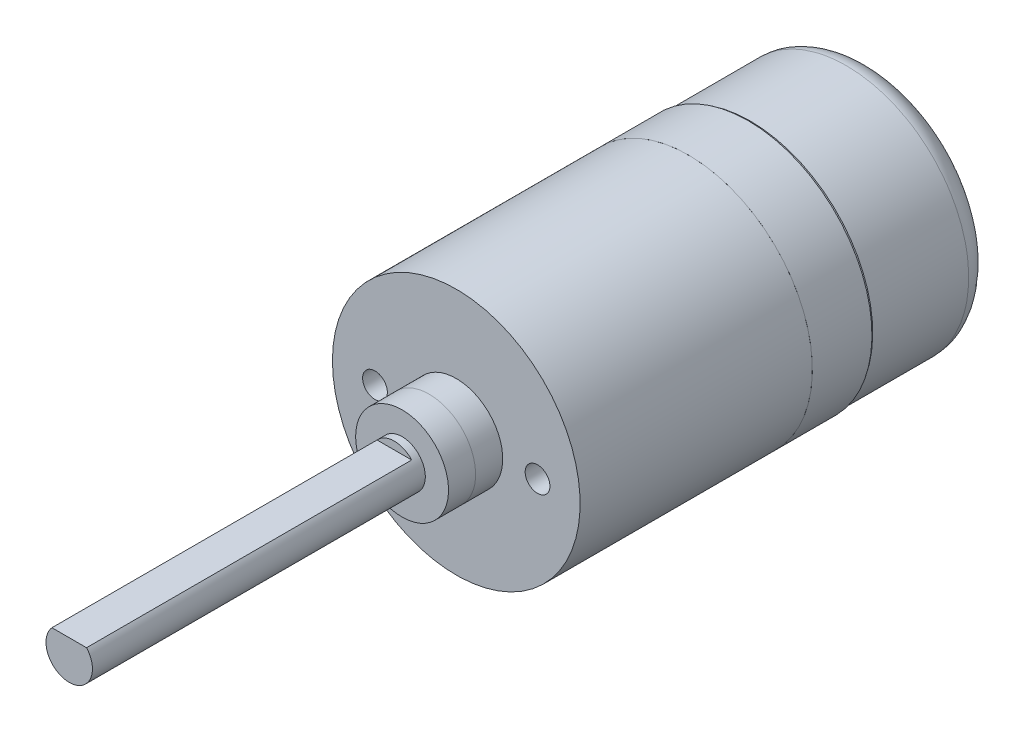
ISO-10303-21;
HEADER;
FILE_DESCRIPTION(('STEP AP214'),'2;1');
FILE_NAME('part.step','',(''),(''),'','','');
FILE_SCHEMA(('AUTOMOTIVE_DESIGN { 1 0 10303 214 1 1 1 1 }'));
ENDSEC;
DATA;
#1=APPLICATION_CONTEXT('core data for automotive mechanical design processes');
#2=APPLICATION_PROTOCOL_DEFINITION('international standard','automotive_design',2000,#1);
#3=PRODUCT_CONTEXT('',#1,'mechanical');
#4=PRODUCT('Part','Part','',(#3));
#5=PRODUCT_RELATED_PRODUCT_CATEGORY('part','',(#4));
#6=PRODUCT_DEFINITION_FORMATION('','',#4);
#7=PRODUCT_DEFINITION_CONTEXT('part definition',#1,'design');
#8=PRODUCT_DEFINITION('design','',#6,#7);
#9=PRODUCT_DEFINITION_SHAPE('','',#8);
#10=(LENGTH_UNIT() NAMED_UNIT(*) SI_UNIT(.MILLI.,.METRE.));
#11=(NAMED_UNIT(*) PLANE_ANGLE_UNIT() SI_UNIT($,.RADIAN.));
#12=(NAMED_UNIT(*) SI_UNIT($,.STERADIAN.) SOLID_ANGLE_UNIT());
#13=UNCERTAINTY_MEASURE_WITH_UNIT(LENGTH_MEASURE(1.E-05),#10,'distance_accuracy_value','');
#14=(GEOMETRIC_REPRESENTATION_CONTEXT(3) GLOBAL_UNCERTAINTY_ASSIGNED_CONTEXT((#13)) GLOBAL_UNIT_ASSIGNED_CONTEXT((#10,
#11,#12)) REPRESENTATION_CONTEXT('',''));
#15=CARTESIAN_POINT('',(0.,0.,0.));
#16=DIRECTION('',(0.,0.,1.));
#17=DIRECTION('',(1.,0.,0.));
#18=AXIS2_PLACEMENT_3D('',#15,#16,#17);
#19=CARTESIAN_POINT('',(-5.25,0.,15.));
#20=DIRECTION('',(0.,0.,1.));
#21=DIRECTION('',(1.,0.,0.));
#22=AXIS2_PLACEMENT_3D('',#19,#20,#21);
#23=CYLINDRICAL_SURFACE('',#22,0.8);
#24=CARTESIAN_POINT('',(-5.25,0.,12.5));
#25=DIRECTION('',(0.,0.,1.));
#26=DIRECTION('',(1.,0.,0.));
#27=AXIS2_PLACEMENT_3D('',#24,#25,#26);
#28=CIRCLE('',#27,0.8);
#29=CARTESIAN_POINT('',(-4.45,0.,12.5));
#30=VERTEX_POINT('',#29);
#31=EDGE_CURVE('P0_E11',#30,#30,#28,.T.);
#32=ORIENTED_EDGE('',*,*,#31,.F.);
#33=EDGE_LOOP('',(#32));
#34=FACE_BOUND('',#33,.T.);
#35=CARTESIAN_POINT('',(-5.25,0.,15.));
#36=DIRECTION('',(0.,0.,1.));
#37=DIRECTION('',(1.,0.,0.));
#38=AXIS2_PLACEMENT_3D('',#35,#36,#37);
#39=CIRCLE('',#38,0.8);
#40=CARTESIAN_POINT('',(-4.45,0.,15.));
#41=VERTEX_POINT('',#40);
#42=EDGE_CURVE('P0_E91',#41,#41,#39,.T.);
#43=ORIENTED_EDGE('',*,*,#42,.T.);
#44=EDGE_LOOP('',(#43));
#45=FACE_BOUND('',#44,.T.);
#46=ADVANCED_FACE('P0_F16',(#34,#45),#23,.F.);
#47=CARTESIAN_POINT('',(-5.25,0.,12.5));
#48=DIRECTION('',(0.,0.,1.));
#49=DIRECTION('',(1.,0.,0.));
#50=AXIS2_PLACEMENT_3D('',#47,#48,#49);
#51=CONICAL_SURFACE('',#50,0.8,1.02974425867665);
#52=CARTESIAN_POINT('',(-5.25,0.,12.0193115047779));
#53=VERTEX_POINT('',#52);
#54=VERTEX_LOOP('',#53);
#55=FACE_BOUND('',#54,.T.);
#56=ORIENTED_EDGE('',*,*,#31,.T.);
#57=EDGE_LOOP('',(#56));
#58=FACE_BOUND('',#57,.T.);
#59=ADVANCED_FACE('P0_F179',(#55,#58),#51,.F.);
#60=CARTESIAN_POINT('',(5.25,0.,15.));
#61=DIRECTION('',(0.,0.,1.));
#62=DIRECTION('',(1.,0.,0.));
#63=AXIS2_PLACEMENT_3D('',#60,#61,#62);
#64=CYLINDRICAL_SURFACE('',#63,0.8);
#65=CARTESIAN_POINT('',(5.25,0.,12.5));
#66=DIRECTION('',(0.,0.,1.));
#67=DIRECTION('',(1.,0.,0.));
#68=AXIS2_PLACEMENT_3D('',#65,#66,#67);
#69=CIRCLE('',#68,0.8);
#70=CARTESIAN_POINT('',(6.05,0.,12.5));
#71=VERTEX_POINT('',#70);
#72=EDGE_CURVE('P0_E25',#71,#71,#69,.T.);
#73=ORIENTED_EDGE('',*,*,#72,.F.);
#74=EDGE_LOOP('',(#73));
#75=FACE_BOUND('',#74,.T.);
#76=CARTESIAN_POINT('',(5.25,0.,15.));
#77=DIRECTION('',(0.,0.,1.));
#78=DIRECTION('',(1.,0.,0.));
#79=AXIS2_PLACEMENT_3D('',#76,#77,#78);
#80=CIRCLE('',#79,0.8);
#81=CARTESIAN_POINT('',(6.05,0.,15.));
#82=VERTEX_POINT('',#81);
#83=EDGE_CURVE('P0_E96',#82,#82,#80,.T.);
#84=ORIENTED_EDGE('',*,*,#83,.T.);
#85=EDGE_LOOP('',(#84));
#86=FACE_BOUND('',#85,.T.);
#87=ADVANCED_FACE('P0_F183',(#75,#86),#64,.F.);
#88=CARTESIAN_POINT('',(5.25,0.,12.5));
#89=DIRECTION('',(0.,0.,1.));
#90=DIRECTION('',(1.,0.,0.));
#91=AXIS2_PLACEMENT_3D('',#88,#89,#90);
#92=CONICAL_SURFACE('',#91,0.8,1.02974425867665);
#93=CARTESIAN_POINT('',(5.25,0.,12.0193115047779));
#94=VERTEX_POINT('',#93);
#95=VERTEX_LOOP('',#94);
#96=FACE_BOUND('',#95,.T.);
#97=ORIENTED_EDGE('',*,*,#72,.T.);
#98=EDGE_LOOP('',(#97));
#99=FACE_BOUND('',#98,.T.);
#100=ADVANCED_FACE('P0_F189',(#96,#99),#92,.F.);
#101=CARTESIAN_POINT('',(0.,0.,19.));
#102=DIRECTION('',(0.,0.,1.));
#103=DIRECTION('',(1.,0.,0.));
#104=AXIS2_PLACEMENT_3D('',#101,#102,#103);
#105=PLANE('',#104);
#106=CARTESIAN_POINT('',(0.,0.,19.));
#107=DIRECTION('',(0.,0.,1.));
#108=DIRECTION('',(1.,0.,0.));
#109=AXIS2_PLACEMENT_3D('',#106,#107,#108);
#110=CIRCLE('',#109,1.5);
#111=CARTESIAN_POINT('',(1.11803398874988,1.,19.));
#112=VERTEX_POINT('',#111);
#113=CARTESIAN_POINT('',(-1.11803398874988,1.,19.));
#114=VERTEX_POINT('',#113);
#115=EDGE_CURVE('P0_E115',#112,#114,#110,.T.);
#116=ORIENTED_EDGE('',*,*,#115,.T.);
#117=DIRECTION('',(1.,0.,0.));
#118=VECTOR('',#117,1.);
#119=CARTESIAN_POINT('',(-1.11803398874988,1.,19.));
#120=LINE('',#119,#118);
#121=EDGE_CURVE('P0_E19',#114,#112,#120,.T.);
#122=ORIENTED_EDGE('',*,*,#121,.T.);
#123=EDGE_LOOP('',(#116,#122));
#124=FACE_BOUND('',#123,.T.);
#125=ADVANCED_FACE('P0_F174',(#124),#105,.T.);
#126=CARTESIAN_POINT('',(-1.11803398874988,1.,19.));
#127=DIRECTION('',(0.,-1.,0.));
#128=DIRECTION('',(0.,0.,-1.));
#129=AXIS2_PLACEMENT_3D('',#126,#127,#128);
#130=PLANE('',#129);
#131=DIRECTION('',(1.,0.,0.));
#132=VECTOR('',#131,1.);
#133=CARTESIAN_POINT('',(-1.11803398874988,1.,40.));
#134=LINE('',#133,#132);
#135=CARTESIAN_POINT('',(-1.11803398874988,1.,40.));
#136=VERTEX_POINT('',#135);
#137=CARTESIAN_POINT('',(1.11803398874988,1.,40.));
#138=VERTEX_POINT('',#137);
#139=EDGE_CURVE('P0_E127',#136,#138,#134,.T.);
#140=ORIENTED_EDGE('',*,*,#139,.T.);
#141=DIRECTION('',(0.,0.,1.));
#142=VECTOR('',#141,1.);
#143=CARTESIAN_POINT('',(1.11803398874988,1.,19.));
#144=LINE('',#143,#142);
#145=EDGE_CURVE('P0_E108',#112,#138,#144,.T.);
#146=ORIENTED_EDGE('',*,*,#145,.F.);
#147=ORIENTED_EDGE('',*,*,#121,.F.);
#148=DIRECTION('',(0.,0.,1.));
#149=VECTOR('',#148,1.);
#150=CARTESIAN_POINT('',(-1.11803398874988,1.,19.));
#151=LINE('',#150,#149);
#152=EDGE_CURVE('P0_E113',#114,#136,#151,.T.);
#153=ORIENTED_EDGE('',*,*,#152,.T.);
#154=EDGE_LOOP('',(#140,#146,#147,#153));
#155=FACE_BOUND('',#154,.T.);
#156=ADVANCED_FACE('P0_F170',(#155),#130,.F.);
#157=CARTESIAN_POINT('',(0.,8.,0.));
#158=DIRECTION('',(0.,0.,-1.));
#159=DIRECTION('',(0.,-1.,0.));
#160=AXIS2_PLACEMENT_3D('',#157,#158,#159);
#161=PLANE('',#160);
#162=CARTESIAN_POINT('',(0.,0.,0.));
#163=DIRECTION('',(0.,0.,-1.));
#164=DIRECTION('',(-1.,0.,0.));
#165=AXIS2_PLACEMENT_3D('',#162,#163,#164);
#166=CIRCLE('',#165,8.);
#167=CARTESIAN_POINT('',(-8.,0.,0.));
#168=VERTEX_POINT('',#167);
#169=EDGE_CURVE('P0_E105',#168,#168,#166,.T.);
#170=ORIENTED_EDGE('',*,*,#169,.T.);
#171=EDGE_LOOP('',(#170));
#172=FACE_BOUND('',#171,.T.);
#173=ADVANCED_FACE('P0_F165',(#172),#161,.T.);
#174=CARTESIAN_POINT('',(0.,0.,0.));
#175=DIRECTION('',(0.,0.,-1.));
#176=DIRECTION('',(-1.,0.,0.));
#177=AXIS2_PLACEMENT_3D('',#174,#175,#176);
#178=CYLINDRICAL_SURFACE('',#177,8.);
#179=CARTESIAN_POINT('',(0.,0.,15.));
#180=DIRECTION('',(0.,0.,-1.));
#181=DIRECTION('',(-1.,0.,0.));
#182=AXIS2_PLACEMENT_3D('',#179,#180,#181);
#183=CIRCLE('',#182,8.);
#184=CARTESIAN_POINT('',(-8.,0.,15.));
#185=VERTEX_POINT('',#184);
#186=EDGE_CURVE('P0_E100',#185,#185,#183,.T.);
#187=ORIENTED_EDGE('',*,*,#186,.T.);
#188=EDGE_LOOP('',(#187));
#189=FACE_BOUND('',#188,.T.);
#190=ORIENTED_EDGE('',*,*,#169,.F.);
#191=EDGE_LOOP('',(#190));
#192=FACE_BOUND('',#191,.T.);
#193=ADVANCED_FACE('P0_F152',(#189,#192),#178,.T.);
#194=CARTESIAN_POINT('',(0.,3.,15.));
#195=DIRECTION('',(0.,0.,1.));
#196=DIRECTION('',(1.,0.,0.));
#197=AXIS2_PLACEMENT_3D('',#194,#195,#196);
#198=PLANE('',#197);
#199=CARTESIAN_POINT('',(0.,0.,15.));
#200=DIRECTION('',(0.,0.,-1.));
#201=DIRECTION('',(-1.,0.,0.));
#202=AXIS2_PLACEMENT_3D('',#199,#200,#201);
#203=CIRCLE('',#202,3.);
#204=CARTESIAN_POINT('',(-3.,0.,15.));
#205=VERTEX_POINT('',#204);
#206=EDGE_CURVE('P0_E102',#205,#205,#203,.T.);
#207=ORIENTED_EDGE('',*,*,#206,.T.);
#208=EDGE_LOOP('',(#207));
#209=FACE_BOUND('',#208,.T.);
#210=ORIENTED_EDGE('',*,*,#83,.F.);
#211=EDGE_LOOP('',(#210));
#212=FACE_BOUND('',#211,.T.);
#213=ORIENTED_EDGE('',*,*,#42,.F.);
#214=EDGE_LOOP('',(#213));
#215=FACE_BOUND('',#214,.T.);
#216=ORIENTED_EDGE('',*,*,#186,.F.);
#217=EDGE_LOOP('',(#216));
#218=FACE_BOUND('',#217,.T.);
#219=ADVANCED_FACE('P0_F146',(#209,#212,#215,#218),#198,.T.);
#220=CARTESIAN_POINT('',(0.,0.,0.));
#221=DIRECTION('',(0.,0.,-1.));
#222=DIRECTION('',(-1.,0.,0.));
#223=AXIS2_PLACEMENT_3D('',#220,#221,#222);
#224=CYLINDRICAL_SURFACE('',#223,3.);
#225=CARTESIAN_POINT('',(0.,0.,16.75));
#226=DIRECTION('',(0.,0.,1.));
#227=DIRECTION('',(-1.,0.,0.));
#228=AXIS2_PLACEMENT_3D('',#225,#226,#227);
#229=CIRCLE('',#228,3.);
#230=CARTESIAN_POINT('',(-3.,0.,16.75));
#231=VERTEX_POINT('',#230);
#232=EDGE_CURVE('P0_E140',#231,#231,#229,.T.);
#233=ORIENTED_EDGE('',*,*,#232,.F.);
#234=EDGE_LOOP('',(#233));
#235=FACE_BOUND('',#234,.T.);
#236=ORIENTED_EDGE('',*,*,#206,.F.);
#237=EDGE_LOOP('',(#236));
#238=FACE_BOUND('',#237,.T.);
#239=ADVANCED_FACE('P0_F145',(#235,#238),#224,.T.);
#240=CARTESIAN_POINT('',(0.,1.5,18.5));
#241=DIRECTION('',(0.,0.,1.));
#242=DIRECTION('',(1.,0.,0.));
#243=AXIS2_PLACEMENT_3D('',#240,#241,#242);
#244=PLANE('',#243);
#245=CARTESIAN_POINT('',(0.,0.,18.5));
#246=DIRECTION('',(0.,0.,-1.));
#247=DIRECTION('',(-1.,0.,0.));
#248=AXIS2_PLACEMENT_3D('',#245,#246,#247);
#249=CIRCLE('',#248,1.5);
#250=CARTESIAN_POINT('',(-1.5,0.,18.5));
#251=VERTEX_POINT('',#250);
#252=EDGE_CURVE('P0_E118',#251,#251,#249,.T.);
#253=ORIENTED_EDGE('',*,*,#252,.T.);
#254=EDGE_LOOP('',(#253));
#255=FACE_BOUND('',#254,.T.);
#256=CARTESIAN_POINT('',(0.,0.,18.5));
#257=DIRECTION('',(0.,0.,-1.));
#258=DIRECTION('',(-1.,0.,0.));
#259=AXIS2_PLACEMENT_3D('',#256,#257,#258);
#260=CIRCLE('',#259,3.);
#261=CARTESIAN_POINT('',(-3.,0.,18.5));
#262=VERTEX_POINT('',#261);
#263=EDGE_CURVE('P0_E133',#262,#262,#260,.T.);
#264=ORIENTED_EDGE('',*,*,#263,.F.);
#265=EDGE_LOOP('',(#264));
#266=FACE_BOUND('',#265,.T.);
#267=ADVANCED_FACE('P0_F150',(#255,#266),#244,.T.);
#268=CARTESIAN_POINT('',(0.,0.,0.));
#269=DIRECTION('',(0.,0.,-1.));
#270=DIRECTION('',(-1.,0.,0.));
#271=AXIS2_PLACEMENT_3D('',#268,#269,#270);
#272=CYLINDRICAL_SURFACE('',#271,1.5);
#273=ORIENTED_EDGE('',*,*,#152,.F.);
#274=ORIENTED_EDGE('',*,*,#115,.F.);
#275=ORIENTED_EDGE('',*,*,#145,.T.);
#276=CARTESIAN_POINT('',(0.,0.,40.));
#277=DIRECTION('',(0.,0.,-1.));
#278=DIRECTION('',(-1.,0.,0.));
#279=AXIS2_PLACEMENT_3D('',#276,#277,#278);
#280=CIRCLE('',#279,1.5);
#281=EDGE_CURVE('P0_E124',#138,#136,#280,.T.);
#282=ORIENTED_EDGE('',*,*,#281,.T.);
#283=EDGE_LOOP('',(#273,#274,#275,#282));
#284=FACE_BOUND('',#283,.T.);
#285=ORIENTED_EDGE('',*,*,#252,.F.);
#286=EDGE_LOOP('',(#285));
#287=FACE_BOUND('',#286,.T.);
#288=ADVANCED_FACE('P0_F192',(#284,#287),#272,.T.);
#289=CARTESIAN_POINT('',(0.,0.,40.));
#290=DIRECTION('',(0.,0.,1.));
#291=DIRECTION('',(1.,0.,0.));
#292=AXIS2_PLACEMENT_3D('',#289,#290,#291);
#293=PLANE('',#292);
#294=ORIENTED_EDGE('',*,*,#139,.F.);
#295=ORIENTED_EDGE('',*,*,#281,.F.);
#296=EDGE_LOOP('',(#294,#295));
#297=FACE_BOUND('',#296,.T.);
#298=ADVANCED_FACE('P0_F203',(#297),#293,.T.);
#299=CARTESIAN_POINT('',(0.,0.,0.));
#300=DIRECTION('',(0.,0.,-1.));
#301=DIRECTION('',(-1.,0.,0.));
#302=AXIS2_PLACEMENT_3D('',#299,#300,#301);
#303=CYLINDRICAL_SURFACE('',#302,3.);
#304=ORIENTED_EDGE('',*,*,#263,.T.);
#305=EDGE_LOOP('',(#304));
#306=FACE_BOUND('',#305,.T.);
#307=ORIENTED_EDGE('',*,*,#232,.T.);
#308=EDGE_LOOP('',(#307));
#309=FACE_BOUND('',#308,.T.);
#310=ADVANCED_FACE('P0_F142',(#306,#309),#303,.T.);
#311=CLOSED_SHELL('',(#46,#59,#87,#100,#125,#156,#173,#193,#219,#239,#267,#288,#298,#310));
#312=MANIFOLD_SOLID_BREP('P0_B1',#311);
#313=CARTESIAN_POINT('',(0.,0.,0.));
#314=DIRECTION('',(0.,0.,-1.));
#315=DIRECTION('',(0.,1.,0.));
#316=AXIS2_PLACEMENT_3D('',#313,#314,#315);
#317=CYLINDRICAL_SURFACE('',#316,6.);
#318=CARTESIAN_POINT('',(0.,0.,-3.85));
#319=DIRECTION('',(0.,0.,-1.));
#320=DIRECTION('',(0.,1.,0.));
#321=AXIS2_PLACEMENT_3D('',#318,#319,#320);
#322=CIRCLE('',#321,6.);
#323=CARTESIAN_POINT('',(0.,6.,-3.85));
#324=VERTEX_POINT('',#323);
#325=EDGE_CURVE('P1_E11',#324,#324,#322,.T.);
#326=ORIENTED_EDGE('',*,*,#325,.T.);
#327=EDGE_LOOP('',(#326));
#328=FACE_BOUND('',#327,.T.);
#329=CARTESIAN_POINT('',(0.,0.,-9.85));
#330=DIRECTION('',(0.,0.,-1.));
#331=DIRECTION('',(0.,1.,0.));
#332=AXIS2_PLACEMENT_3D('',#329,#330,#331);
#333=CIRCLE('',#332,6.);
#334=CARTESIAN_POINT('',(0.,6.,-9.85));
#335=VERTEX_POINT('',#334);
#336=EDGE_CURVE('P1_E55',#335,#335,#333,.T.);
#337=ORIENTED_EDGE('',*,*,#336,.F.);
#338=EDGE_LOOP('',(#337));
#339=FACE_BOUND('',#338,.T.);
#340=ADVANCED_FACE('P1_F16',(#328,#339),#317,.T.);
#341=CARTESIAN_POINT('',(0.,8.,-3.85));
#342=DIRECTION('',(0.,0.,-1.));
#343=DIRECTION('',(-1.,0.,0.));
#344=AXIS2_PLACEMENT_3D('',#341,#342,#343);
#345=PLANE('',#344);
#346=ORIENTED_EDGE('',*,*,#325,.F.);
#347=EDGE_LOOP('',(#346));
#348=FACE_BOUND('',#347,.T.);
#349=CARTESIAN_POINT('',(0.,0.,-3.85));
#350=DIRECTION('',(0.,0.,-1.));
#351=DIRECTION('',(0.,1.,0.));
#352=AXIS2_PLACEMENT_3D('',#349,#350,#351);
#353=CIRCLE('',#352,8.);
#354=CARTESIAN_POINT('',(0.,8.,-3.85));
#355=VERTEX_POINT('',#354);
#356=EDGE_CURVE('P1_E24',#355,#355,#353,.T.);
#357=ORIENTED_EDGE('',*,*,#356,.T.);
#358=EDGE_LOOP('',(#357));
#359=FACE_BOUND('',#358,.T.);
#360=ADVANCED_FACE('P1_F105',(#348,#359),#345,.T.);
#361=CARTESIAN_POINT('',(0.,0.,0.));
#362=DIRECTION('',(0.,0.,-1.));
#363=DIRECTION('',(0.,1.,0.));
#364=AXIS2_PLACEMENT_3D('',#361,#362,#363);
#365=CYLINDRICAL_SURFACE('',#364,8.);
#366=CARTESIAN_POINT('',(0.,0.,0.));
#367=DIRECTION('',(0.,0.,-1.));
#368=DIRECTION('',(0.,1.,0.));
#369=AXIS2_PLACEMENT_3D('',#366,#367,#368);
#370=CIRCLE('',#369,8.);
#371=CARTESIAN_POINT('',(0.,8.,0.));
#372=VERTEX_POINT('',#371);
#373=EDGE_CURVE('P1_E57',#372,#372,#370,.T.);
#374=ORIENTED_EDGE('',*,*,#373,.T.);
#375=EDGE_LOOP('',(#374));
#376=FACE_BOUND('',#375,.T.);
#377=ORIENTED_EDGE('',*,*,#356,.F.);
#378=EDGE_LOOP('',(#377));
#379=FACE_BOUND('',#378,.T.);
#380=ADVANCED_FACE('P1_F93',(#376,#379),#365,.T.);
#381=CARTESIAN_POINT('',(0.,0.,0.));
#382=DIRECTION('',(0.,0.,1.));
#383=DIRECTION('',(0.,-1.,0.));
#384=AXIS2_PLACEMENT_3D('',#381,#382,#383);
#385=PLANE('',#384);
#386=ORIENTED_EDGE('',*,*,#373,.F.);
#387=EDGE_LOOP('',(#386));
#388=FACE_BOUND('',#387,.T.);
#389=ADVANCED_FACE('P1_F79',(#388),#385,.T.);
#390=CARTESIAN_POINT('',(0.,6.,-9.85));
#391=DIRECTION('',(0.,0.,-1.));
#392=DIRECTION('',(-1.,0.,0.));
#393=AXIS2_PLACEMENT_3D('',#390,#391,#392);
#394=PLANE('',#393);
#395=ORIENTED_EDGE('',*,*,#336,.T.);
#396=EDGE_LOOP('',(#395));
#397=FACE_BOUND('',#396,.T.);
#398=ADVANCED_FACE('P1_F52',(#397),#394,.T.);
#399=CLOSED_SHELL('',(#340,#360,#380,#389,#398));
#400=MANIFOLD_SOLID_BREP('P1_B1',#399);
#401=CARTESIAN_POINT('',(0.,4.9,-12.2));
#402=CARTESIAN_POINT('',(0.641408495655411,4.9,-12.2));
#403=CARTESIAN_POINT('',(1.28256463747401,4.77246611397071,-12.2));
#404=CARTESIAN_POINT('',(2.46773299970387,4.2815533046399,-12.2));
#405=CARTESIAN_POINT('',(3.01127893102555,3.9183675246029,-12.2));
#406=CARTESIAN_POINT('',(3.91836752460263,3.01127893102527,-12.2));
#407=CARTESIAN_POINT('',(4.28155330463977,2.46773299970391,-12.2));
#408=CARTESIAN_POINT('',(4.77246611397085,1.28256463747397,-12.2));
#409=CARTESIAN_POINT('',(4.9,0.641408495655548,-12.2));
#410=CARTESIAN_POINT('',(4.9,-0.641408495655544,-12.2));
#411=CARTESIAN_POINT('',(4.77246611397084,-1.28256463747397,-12.2));
#412=CARTESIAN_POINT('',(4.28155330463977,-2.46773299970392,-12.2));
#413=CARTESIAN_POINT('',(3.91836752460279,-3.01127893102551,-12.2));
#414=CARTESIAN_POINT('',(3.01127893102537,-3.91836752460266,-12.2));
#415=CARTESIAN_POINT('',(2.4677329997039,-4.28155330463975,-12.2));
#416=CARTESIAN_POINT('',(1.28256463747399,-4.77246611397085,-12.2));
#417=CARTESIAN_POINT('',(0.641408495655546,-4.9,-12.2));
#418=CARTESIAN_POINT('',(-0.641408495655545,-4.9,-12.2));
#419=CARTESIAN_POINT('',(-1.28256463747391,-4.77246611397114,-12.2));
#420=CARTESIAN_POINT('',(-2.46773299970396,-4.28155330463948,-12.2));
#421=CARTESIAN_POINT('',(-3.01127893102537,-3.91836752460265,-12.2));
#422=CARTESIAN_POINT('',(-3.91836752460279,-3.01127893102551,-12.2));
#423=CARTESIAN_POINT('',(-4.28155330463977,-2.46773299970394,-12.2));
#424=CARTESIAN_POINT('',(-4.77246611397083,-1.28256463747395,-12.2));
#425=CARTESIAN_POINT('',(-4.9,-0.641408495655537,-12.2));
#426=CARTESIAN_POINT('',(-4.9,0.641408495655556,-12.2));
#427=CARTESIAN_POINT('',(-4.77246611397111,1.28256463747387,-12.2));
#428=CARTESIAN_POINT('',(-4.28155330463951,2.467732999704,-12.2));
#429=CARTESIAN_POINT('',(-3.91836752460281,3.01127893102535,-12.2));
#430=CARTESIAN_POINT('',(-3.01127893102537,3.91836752460279,-12.2));
#431=CARTESIAN_POINT('',(-2.46773299970401,4.28155330463977,-12.2));
#432=CARTESIAN_POINT('',(-1.28256463747389,4.77246611397083,-12.2));
#433=CARTESIAN_POINT('',(-0.641408495655412,4.9,-12.2));
#434=CARTESIAN_POINT('',(0.,4.9,-12.2));
#435=CARTESIAN_POINT('',(0.,7.9,-12.2));
#436=CARTESIAN_POINT('',(1.03410757462811,7.89999999999944,-12.2));
#437=CARTESIAN_POINT('',(2.06780829307035,7.69438414293231,-12.2));
#438=CARTESIAN_POINT('',(3.97858993829807,6.90291247074602,-12.2));
#439=CARTESIAN_POINT('',(4.85491909287788,6.31736804986957,-12.2));
#440=CARTESIAN_POINT('',(6.31736804986957,4.85491909287788,-12.2));
#441=CARTESIAN_POINT('',(6.90291247074581,3.97858993829803,-12.2));
#442=CARTESIAN_POINT('',(7.69438414293252,2.06780829307038,-12.2));
#443=CARTESIAN_POINT('',(7.9,1.03410757462833,-12.2));
#444=CARTESIAN_POINT('',(7.9,-1.03410757462833,-12.2));
#445=CARTESIAN_POINT('',(7.69438414293252,-2.06780829307025,-12.2));
#446=CARTESIAN_POINT('',(6.90291247074581,-3.97858993829817,-12.2));
#447=CARTESIAN_POINT('',(6.31736804986972,-4.85491909287773,-12.2000000000005));
#448=CARTESIAN_POINT('',(4.85491909287772,-6.31736804986972,-12.1999999999994));
#449=CARTESIAN_POINT('',(3.97858993829798,-6.90291247074568,-12.2));
#450=CARTESIAN_POINT('',(2.06780829307046,-7.69438414293265,-12.2));
#451=CARTESIAN_POINT('',(1.03410757462833,-7.9,-12.2));
#452=CARTESIAN_POINT('',(-1.03410757462833,-7.9,-12.2));
#453=CARTESIAN_POINT('',(-2.06780829307016,-7.69438414293265,-12.2));
#454=CARTESIAN_POINT('',(-3.97858993829823,-6.90291247074568,-12.2));
#455=CARTESIAN_POINT('',(-4.85491909287773,-6.31736804986972,-12.2));
#456=CARTESIAN_POINT('',(-6.31736804986973,-4.85491909287773,-12.2));
#457=CARTESIAN_POINT('',(-6.90291247074592,-3.97858993829838,-12.2));
#458=CARTESIAN_POINT('',(-7.69438414293239,-2.06780829307005,-12.2));
#459=CARTESIAN_POINT('',(-7.9,-1.03410757462832,-12.2));
#460=CARTESIAN_POINT('',(-7.9,1.03410757462834,-12.2));
#461=CARTESIAN_POINT('',(-7.69438414293296,2.06780829307017,-12.2));
#462=CARTESIAN_POINT('',(-6.90291247074538,3.97858993829823,-12.2));
#463=CARTESIAN_POINT('',(-6.31736804986993,4.85491909287723,-12.2));
#464=CARTESIAN_POINT('',(-4.85491909287754,6.31736804987018,-12.2));
#465=CARTESIAN_POINT('',(-3.97858993829839,6.90291247074565,-12.2));
#466=CARTESIAN_POINT('',(-2.06780829307005,7.69438414293268,-12.2));
#467=CARTESIAN_POINT('',(-1.03410757462811,7.90000000000055,-12.2));
#468=CARTESIAN_POINT('',(0.,7.9,-12.2));
#469=CARTESIAN_POINT('',(0.,7.9,-10.2));
#470=CARTESIAN_POINT('',(1.03410757462811,7.9,-10.2));
#471=CARTESIAN_POINT('',(2.06780829307046,7.69438414293257,-10.2));
#472=CARTESIAN_POINT('',(3.97858993829796,6.90291247074576,-10.2));
#473=CARTESIAN_POINT('',(4.85491909287789,6.31736804986957,-10.2));
#474=CARTESIAN_POINT('',(6.31736804986957,4.85491909287789,-10.2));
#475=CARTESIAN_POINT('',(6.90291247074575,3.978589938298,-10.2));
#476=CARTESIAN_POINT('',(7.69438414293259,2.06780829307041,-10.2));
#477=CARTESIAN_POINT('',(7.9,1.03410757462833,-10.2));
#478=CARTESIAN_POINT('',(7.9,-1.03410757462833,-10.2));
#479=CARTESIAN_POINT('',(7.69438414293264,-2.0678082930703,-10.2));
#480=CARTESIAN_POINT('',(6.90291247074569,-3.97858993829813,-10.2));
#481=CARTESIAN_POINT('',(6.31736804986972,-4.85491909287773,-10.2));
#482=CARTESIAN_POINT('',(4.85491909287772,-6.31736804986973,-10.2));
#483=CARTESIAN_POINT('',(3.978589938298,-6.90291247074574,-10.2));
#484=CARTESIAN_POINT('',(2.06780829307043,-7.69438414293258,-10.2));
#485=CARTESIAN_POINT('',(1.03410757462833,-7.9,-10.2));
#486=CARTESIAN_POINT('',(-1.03410757462833,-7.9,-10.2));
#487=CARTESIAN_POINT('',(-2.06780829307018,-7.69438414293268,-10.2));
#488=CARTESIAN_POINT('',(-3.97858993829822,-6.90291247074566,-10.2));
#489=CARTESIAN_POINT('',(-4.85491909287773,-6.31736804986972,-10.2));
#490=CARTESIAN_POINT('',(-6.31736804986973,-4.85491909287772,-10.2));
#491=CARTESIAN_POINT('',(-6.90291247074569,-3.97858993829815,-10.2));
#492=CARTESIAN_POINT('',(-7.69438414293264,-2.06780829307029,-10.2));
#493=CARTESIAN_POINT('',(-7.9,-1.03410757462832,-10.2));
#494=CARTESIAN_POINT('',(-7.9,1.03410757462834,-10.2));
#495=CARTESIAN_POINT('',(-7.69438414293273,2.06780829307008,-10.2));
#496=CARTESIAN_POINT('',(-6.90291247074561,3.97858993829832,-10.2));
#497=CARTESIAN_POINT('',(-6.31736804986994,4.85491909287751,-10.2));
#498=CARTESIAN_POINT('',(-4.85491909287754,6.31736804986991,-10.2));
#499=CARTESIAN_POINT('',(-3.97858993829836,6.9029124707456,-10.2));
#500=CARTESIAN_POINT('',(-2.06780829307008,7.69438414293273,-10.2));
#501=CARTESIAN_POINT('',(-1.03410757462811,7.9,-10.2));
#502=CARTESIAN_POINT('',(0.,7.9,-10.2));
#503=(BOUNDED_SURFACE() B_SPLINE_SURFACE(2,3,((#401,#402,#403,#404,#405,#406,#407,#408,#409,
#410,#411,#412,#413,#414,#415,#416,#417,#418,#419,#420,#421,#422,#423,#424,#425,#426,#427,#428,
#429,#430,#431,#432,#433,#434),(#435,#436,#437,#438,#439,#440,#441,#442,#443,#444,#445,#446,
#447,#448,#449,#450,#451,#452,#453,#454,#455,#456,#457,#458,#459,#460,#461,#462,#463,#464,#465,
#466,#467,#468),(#469,#470,#471,#472,#473,#474,#475,#476,#477,#478,#479,#480,#481,#482,#483,
#484,#485,#486,#487,#488,#489,#490,#491,#492,#493,#494,#495,#496,#497,#498,#499,#500,#501,
#502)),.UNSPECIFIED.,.F.,.T.,.F.) B_SPLINE_SURFACE_WITH_KNOTS((3,3),(4,2,2,2,2,2,2,2,2,2,2,2,2,
2,2,2,4),(0.,1.),(0.,0.392699081698724,0.785398163397448,1.17809724509617,1.5707963267949,
1.96349540849362,2.35619449019234,2.74889357189107,3.1415926535898,3.53429173528852,
3.92699081698724,4.31968989868597,4.71238898038469,5.10508806208341,5.49778714378214,
5.89048622548086,6.28318530717959),
.UNSPECIFIED.) GEOMETRIC_REPRESENTATION_ITEM() RATIONAL_B_SPLINE_SURFACE(((1.,1.,1.,1.,1.,1.,1.,
1.,1.,1.,1.,1.,1.,1.,1.,1.,1.,1.,1.,1.,1.,1.,1.,1.,1.,1.,1.,1.,1.,1.,1.,1.,1.,1.),
(0.707106781186548,0.707106781186548,0.707106781186548,0.707106781186548,0.707106781186548,
0.707106781186548,0.707106781186548,0.707106781186548,0.707106781186548,0.707106781186548,
0.707106781186548,0.707106781186548,0.707106781186548,0.707106781186548,0.707106781186548,
0.707106781186548,0.707106781186548,0.707106781186548,0.707106781186548,0.707106781186548,
0.707106781186547,0.707106781186547,0.707106781186548,0.707106781186548,0.707106781186548,
0.707106781186548,0.707106781186548,0.707106781186548,0.707106781186548,0.707106781186548,
0.707106781186548,0.707106781186548,0.707106781186548,0.707106781186548),(1.,1.,1.,1.,1.,1.,1.,
1.,1.,1.,1.,1.,1.,1.,1.,1.,1.,1.,1.,1.,1.,1.,1.,1.,1.,1.,1.,1.,1.,1.,1.,1.,1.,1.))) REPRESENTATION_ITEM('') SURFACE());
#504=CARTESIAN_POINT('',(0.,7.9,-10.2000000000107));
#505=CARTESIAN_POINT('',(1.03410757462811,7.9,-10.2000000000107));
#506=CARTESIAN_POINT('',(2.06780829307046,7.69438414293257,-10.2000000000107));
#507=CARTESIAN_POINT('',(3.97858993829796,6.90291247074576,-10.2000000000107));
#508=CARTESIAN_POINT('',(4.85491909287789,6.31736804986957,-10.2000000000107));
#509=CARTESIAN_POINT('',(6.31736804986957,4.85491909287789,-10.2000000000107));
#510=CARTESIAN_POINT('',(6.90291247074575,3.978589938298,-10.2000000000107));
#511=CARTESIAN_POINT('',(7.69438414293259,2.06780829307041,-10.2000000000107));
#512=CARTESIAN_POINT('',(7.9,1.03410757462833,-10.2000000000107));
#513=CARTESIAN_POINT('',(7.9,-1.03410757462833,-10.2000000000107));
#514=CARTESIAN_POINT('',(7.69438414293264,-2.06780829307029,-10.2000000000107));
#515=CARTESIAN_POINT('',(6.90291247074569,-3.97858993829812,-10.2000000000107));
#516=CARTESIAN_POINT('',(6.31736804986972,-4.85491909287773,-10.2000000000107));
#517=CARTESIAN_POINT('',(4.85491909287772,-6.31736804986973,-10.2000000000107));
#518=CARTESIAN_POINT('',(3.978589938298,-6.90291247074574,-10.2000000000107));
#519=CARTESIAN_POINT('',(2.06780829307043,-7.69438414293258,-10.2000000000107));
#520=CARTESIAN_POINT('',(1.03410757462833,-7.9,-10.2000000000107));
#521=CARTESIAN_POINT('',(-1.03410757462833,-7.9,-10.2000000000107));
#522=CARTESIAN_POINT('',(-2.06780829307017,-7.69438414293268,-10.2000000000107));
#523=CARTESIAN_POINT('',(-3.97858993829822,-6.90291247074566,-10.2000000000107));
#524=CARTESIAN_POINT('',(-4.85491909287773,-6.31736804986972,-10.2000000000107));
#525=CARTESIAN_POINT('',(-6.31736804986973,-4.85491909287772,-10.2000000000107));
#526=CARTESIAN_POINT('',(-6.90291247074569,-3.97858993829814,-10.2000000000107));
#527=CARTESIAN_POINT('',(-7.69438414293264,-2.06780829307029,-10.2000000000107));
#528=CARTESIAN_POINT('',(-7.9,-1.03410757462832,-10.2000000000107));
#529=CARTESIAN_POINT('',(-7.9,1.03410757462834,-10.2000000000107));
#530=CARTESIAN_POINT('',(-7.69438414293273,2.06780829307007,-10.2000000000107));
#531=CARTESIAN_POINT('',(-6.90291247074561,3.97858993829832,-10.2000000000107));
#532=CARTESIAN_POINT('',(-6.31736804986994,4.85491909287751,-10.2000000000107));
#533=CARTESIAN_POINT('',(-4.85491909287754,6.31736804986991,-10.2000000000107));
#534=CARTESIAN_POINT('',(-3.97858993829836,6.9029124707456,-10.2000000000107));
#535=CARTESIAN_POINT('',(-2.06780829307007,7.69438414293273,-10.2000000000107));
#536=CARTESIAN_POINT('',(-1.03410757462811,7.9,-10.2000000000107));
#537=CARTESIAN_POINT('',(0.,7.9,-10.2000000000107));
#538=(BOUNDED_CURVE() B_SPLINE_CURVE(3,(#504,#505,#506,#507,#508,#509,#510,#511,#512,#513,#514,
#515,#516,#517,#518,#519,#520,#521,#522,#523,#524,#525,#526,#527,#528,#529,#530,#531,#532,#533,
#534,#535,#536,#537),.UNSPECIFIED.,.T.,.F.) B_SPLINE_CURVE_WITH_KNOTS((4,2,2,2,2,2,2,2,2,2,2,2,
2,2,2,2,4),(0.,0.392699081698724,0.785398163397448,1.17809724509617,1.5707963267949,
1.96349540849362,2.35619449019234,2.74889357189107,3.1415926535898,3.53429173528852,
3.92699081698724,4.31968989868597,4.71238898038469,5.10508806208341,5.49778714378214,
5.89048622548086,6.28318530717959),
.UNSPECIFIED.) CURVE() GEOMETRIC_REPRESENTATION_ITEM() RATIONAL_B_SPLINE_CURVE((0.99999999999779,
0.99999999999779,0.99999999999779,0.99999999999779,0.99999999999779,0.99999999999779,
0.99999999999779,0.99999999999779,0.99999999999779,0.99999999999779,0.99999999999779,
0.99999999999779,0.99999999999779,0.99999999999779,0.99999999999779,0.99999999999779,
0.99999999999779,0.99999999999779,0.99999999999779,0.99999999999779,0.99999999999779,
0.99999999999779,0.99999999999779,0.99999999999779,0.99999999999779,0.99999999999779,
0.99999999999779,0.99999999999779,0.99999999999779,0.99999999999779,0.99999999999779,
0.99999999999779,0.99999999999779,0.99999999999779)) REPRESENTATION_ITEM(''));
#539=CARTESIAN_POINT('',(0.,7.9,-10.2));
#540=VERTEX_POINT('',#539);
#541=EDGE_CURVE('P2_E69',#540,#540,#538,.F.);
#542=CARTESIAN_POINT('',(0.,4.9,-12.2));
#543=CARTESIAN_POINT('',(0.320523115376676,4.9,-12.2));
#544=CARTESIAN_POINT('',(0.639679166185058,4.86841199503784,-12.2));
#545=CARTESIAN_POINT('',(0.955883527247151,4.80555100640218,-12.2));
#546=CARTESIAN_POINT('',(1.27208788830924,4.74269001776652,-12.2));
#547=CARTESIAN_POINT('',(1.5791764300156,4.64956681739008,-12.2));
#548=CARTESIAN_POINT('',(1.87514881858894,4.52700970930531,-12.2));
#549=CARTESIAN_POINT('',(2.46709359573562,4.28189549313575,-12.2));
#550=CARTESIAN_POINT('',(3.01173871339578,3.91780669435115,-12.2));
#551=CARTESIAN_POINT('',(3.46482322781408,3.46482322781408,-12.2));
#552=CARTESIAN_POINT('',(3.91790774223239,3.01183976127703,-12.2));
#553=CARTESIAN_POINT('',(4.28176346771578,2.46703890901724,-12.2));
#554=CARTESIAN_POINT('',(4.52700970930531,1.87514881858894,-12.2));
#555=CARTESIAN_POINT('',(4.77225595089483,1.28325872816064,-12.2));
#556=CARTESIAN_POINT('',(4.89992854835809,0.640686813547022,-12.2));
#557=CARTESIAN_POINT('',(4.9,0.,-12.2));
#558=CARTESIAN_POINT('',(4.90007145164192,-0.640686813547019,-12.2));
#559=CARTESIAN_POINT('',(4.77212392547453,-1.28320404144293,-12.2));
#560=CARTESIAN_POINT('',(4.52700970930531,-1.87514881858894,-12.2));
#561=CARTESIAN_POINT('',(4.28189549313608,-2.46709359573495,-12.2));
#562=CARTESIAN_POINT('',(3.91780669435074,-3.01173871339617,-12.2));
#563=CARTESIAN_POINT('',(3.46482322781408,-3.46482322781408,-12.2));
#564=CARTESIAN_POINT('',(3.01183976127742,-3.917907742232,-12.2));
#565=CARTESIAN_POINT('',(2.4670389090125,-4.28176346771672,-12.2));
#566=CARTESIAN_POINT('',(1.87514881858894,-4.5270097093053,-12.2));
#567=CARTESIAN_POINT('',(1.28325872816539,-4.77225595089389,-12.2));
#568=CARTESIAN_POINT('',(0.640686813550465,-4.89992854835808,-12.2));
#569=CARTESIAN_POINT('',(0.,-4.9,-12.2));
#570=CARTESIAN_POINT('',(-0.640686813550464,-4.90007145164192,-12.2));
#571=CARTESIAN_POINT('',(-1.28320404144117,-4.77212392547578,-12.2));
#572=CARTESIAN_POINT('',(-1.87514881858894,-4.52700970930531,-12.2));
#573=CARTESIAN_POINT('',(-2.4670935957367,-4.28189549313484,-12.2));
#574=CARTESIAN_POINT('',(-3.01173871339315,-3.91780669435377,-12.2));
#575=CARTESIAN_POINT('',(-3.46482322781408,-3.46482322781408,-12.2));
#576=CARTESIAN_POINT('',(-3.91790774223502,-3.01183976127439,-12.2));
#577=CARTESIAN_POINT('',(-4.28176346771475,-2.46703890902,-12.2));
#578=CARTESIAN_POINT('',(-4.5270097093053,-1.87514881858894,-12.2));
#579=CARTESIAN_POINT('',(-4.77225595089586,-1.28325872815789,-12.2));
#580=CARTESIAN_POINT('',(-4.89992854835809,-0.640686813550311,-12.2));
#581=CARTESIAN_POINT('',(-4.9,0.,-12.2));
#582=CARTESIAN_POINT('',(-4.90007145164192,0.640686813550331,-12.2));
#583=CARTESIAN_POINT('',(-4.77212392547594,1.28320404144078,-12.2));
#584=CARTESIAN_POINT('',(-4.52700970930531,1.87514881858894,-12.2));
#585=CARTESIAN_POINT('',(-4.28189549313468,2.46709359573708,-12.2));
#586=CARTESIAN_POINT('',(-3.91780669435451,3.01173871339214,-12.2));
#587=CARTESIAN_POINT('',(-3.4648232278141,3.46482322781408,-12.2));
#588=CARTESIAN_POINT('',(-3.01183976127367,3.91790774223601,-12.2));
#589=CARTESIAN_POINT('',(-2.46703890901517,4.28176346771624,-12.2));
#590=CARTESIAN_POINT('',(-1.87514881858894,4.5270097093053,-12.2));
#591=CARTESIAN_POINT('',(-1.57920377337584,4.64963283009984,-12.2));
#592=CARTESIAN_POINT('',(-1.27225403098078,4.74258501067038,-12.2));
#593=CARTESIAN_POINT('',(-0.955883527247105,4.80555100640223,-12.2));
#594=CARTESIAN_POINT('',(-0.639513023513426,4.86851700213408,-12.2));
#595=CARTESIAN_POINT('',(-0.320885181097725,4.9,-12.2));
#596=CARTESIAN_POINT('',(0.,4.9,-12.2));
#597=(BOUNDED_CURVE() B_SPLINE_CURVE(3,(#542,#543,#544,#545,#546,#547,#548,#549,#550,#551,#552,
#553,#554,#555,#556,#557,#558,#559,#560,#561,#562,#563,#564,#565,#566,#567,#568,#569,#570,#571,
#572,#573,#574,#575,#576,#577,#578,#579,#580,#581,#582,#583,#584,#585,#586,#587,#588,#589,#590,
#591,#592,#593,#594,#595,#596),.UNSPECIFIED.,.T.,.F.) B_SPLINE_CURVE_WITH_KNOTS((4,3,3,3,3,3,3,
3,3,3,3,3,3,3,3,3,3,3,4),(0.,0.0555555555555556,0.111111111111111,0.166666666666667,
0.222222222222222,0.277777777777778,0.333333333333334,0.388888888888889,0.444444444444444,0.5,
0.555555555555556,0.611111111111111,0.666666666666667,0.722222222222222,0.777777777777778,
0.833333333333333,0.888888888888889,0.944444444444444,1.),
.UNSPECIFIED.) CURVE() GEOMETRIC_REPRESENTATION_ITEM() RATIONAL_B_SPLINE_CURVE((1.,1.,1.,1.,1.,
1.,1.,1.,1.,1.,1.,1.,1.,1.,1.,1.,1.,1.,1.,1.,1.,1.,1.,1.,1.,1.,1.,1.,1.,1.,1.,1.,1.,1.,1.,1.,1.,
1.,1.,1.,1.,1.,1.,1.,1.,1.,1.,1.,1.,1.,1.,1.,1.,1.,1.)) REPRESENTATION_ITEM(''));
#598=CARTESIAN_POINT('',(0.,4.9,-12.2));
#599=VERTEX_POINT('',#598);
#600=EDGE_CURVE('P2_E11',#599,#599,#597,.T.);
#601=CARTESIAN_POINT('',(0.,4.89986423549801,-12.2));
#602=CARTESIAN_POINT('',(0.641390724123782,4.89986423549801,-12.2));
#603=CARTESIAN_POINT('',(1.28252910140273,4.77233388305536,-12.2));
#604=CARTESIAN_POINT('',(2.46766462612392,4.28143467546599,-12.2));
#605=CARTESIAN_POINT('',(3.01119549739607,3.91825895823237,-12.2));
#606=CARTESIAN_POINT('',(3.9182589582321,3.0111954973958,-12.2));
#607=CARTESIAN_POINT('',(4.28143467546586,2.46766462612396,-12.2));
#608=CARTESIAN_POINT('',(4.7723338830555,1.28252910140269,-12.2));
#609=CARTESIAN_POINT('',(4.89986423549801,0.641390724123919,-12.2));
#610=CARTESIAN_POINT('',(4.89986423549801,-0.641390724123915,-12.2));
#611=CARTESIAN_POINT('',(4.77233388305549,-1.28252910140269,-12.2));
#612=CARTESIAN_POINT('',(4.28143467546586,-2.46766462612397,-12.2));
#613=CARTESIAN_POINT('',(3.91825895823226,-3.01119549739604,-12.2));
#614=CARTESIAN_POINT('',(3.0111954973959,-3.91825895823213,-12.2));
#615=CARTESIAN_POINT('',(2.46766462612395,-4.28143467546584,-12.2));
#616=CARTESIAN_POINT('',(1.28252910140271,-4.7723338830555,-12.2));
#617=CARTESIAN_POINT('',(0.641390724123917,-4.89986423549801,-12.2));
#618=CARTESIAN_POINT('',(-0.641390724123916,-4.89986423549801,-12.2));
#619=CARTESIAN_POINT('',(-1.28252910140263,-4.77233388305579,-12.2));
#620=CARTESIAN_POINT('',(-2.46766462612401,-4.28143467546557,-12.2));
#621=CARTESIAN_POINT('',(-3.0111954973959,-3.91825895823212,-12.2));
#622=CARTESIAN_POINT('',(-3.91825895823227,-3.01119549739604,-12.2));
#623=CARTESIAN_POINT('',(-4.28143467546587,-2.46766462612399,-12.2));
#624=CARTESIAN_POINT('',(-4.77233388305548,-1.28252910140267,-12.2));
#625=CARTESIAN_POINT('',(-4.89986423549801,-0.641390724123908,-12.2));
#626=CARTESIAN_POINT('',(-4.89986423549801,0.641390724123927,-12.2));
#627=CARTESIAN_POINT('',(-4.77233388305576,1.28252910140259,-12.2));
#628=CARTESIAN_POINT('',(-4.2814346754656,2.46766462612405,-12.2));
#629=CARTESIAN_POINT('',(-3.91825895823229,3.01119549739588,-12.2));
#630=CARTESIAN_POINT('',(-3.0111954973959,3.91825895823227,-12.2));
#631=CARTESIAN_POINT('',(-2.46766462612406,4.28143467546587,-12.2));
#632=CARTESIAN_POINT('',(-1.28252910140261,4.77233388305548,-12.2));
#633=CARTESIAN_POINT('',(-0.641390724123783,4.89986423549801,-12.2));
#634=CARTESIAN_POINT('',(0.,4.89986423549801,-12.2));
#635=CARTESIAN_POINT('',(0.,4.89993211774901,-12.2));
#636=CARTESIAN_POINT('',(0.641399609889596,4.89993211774901,-12.2));
#637=CARTESIAN_POINT('',(1.28254686943837,4.77239999851303,-12.2));
#638=CARTESIAN_POINT('',(2.4676988129139,4.28149399005295,-12.2));
#639=CARTESIAN_POINT('',(3.01123721421081,3.91831324141764,-12.2));
#640=CARTESIAN_POINT('',(3.91831324141736,3.01123721421053,-12.2));
#641=CARTESIAN_POINT('',(4.28149399005282,2.46769881291394,-12.2));
#642=CARTESIAN_POINT('',(4.77239999851317,1.28254686943833,-12.2));
#643=CARTESIAN_POINT('',(4.89993211774901,0.641399609889733,-12.2));
#644=CARTESIAN_POINT('',(4.89993211774901,-0.641399609889729,-12.2));
#645=CARTESIAN_POINT('',(4.77239999851316,-1.28254686943833,-12.2));
#646=CARTESIAN_POINT('',(4.28149399005281,-2.46769881291394,-12.2));
#647=CARTESIAN_POINT('',(3.91831324141753,-3.01123721421078,-12.2));
#648=CARTESIAN_POINT('',(3.01123721421063,-3.91831324141739,-12.2));
#649=CARTESIAN_POINT('',(2.46769881291393,-4.2814939900528,-12.2));
#650=CARTESIAN_POINT('',(1.28254686943835,-4.77239999851317,-12.2));
#651=CARTESIAN_POINT('',(0.641399609889731,-4.89993211774901,-12.2));
#652=CARTESIAN_POINT('',(-0.64139960988973,-4.89993211774901,-12.2));
#653=CARTESIAN_POINT('',(-1.28254686943827,-4.77239999851346,-12.2));
#654=CARTESIAN_POINT('',(-2.46769881291398,-4.28149399005253,-12.2));
#655=CARTESIAN_POINT('',(-3.01123721421064,-3.91831324141739,-12.2));
#656=CARTESIAN_POINT('',(-3.91831324141753,-3.01123721421077,-12.2));
#657=CARTESIAN_POINT('',(-4.28149399005282,-2.46769881291396,-12.2));
#658=CARTESIAN_POINT('',(-4.77239999851315,-1.28254686943831,-12.2));
#659=CARTESIAN_POINT('',(-4.89993211774901,-0.641399609889722,-12.2));
#660=CARTESIAN_POINT('',(-4.89993211774901,0.641399609889741,-12.2));
#661=CARTESIAN_POINT('',(-4.77239999851343,1.28254686943823,-12.2));
#662=CARTESIAN_POINT('',(-4.28149399005255,2.46769881291402,-12.2));
#663=CARTESIAN_POINT('',(-3.91831324141755,3.01123721421062,-12.2));
#664=CARTESIAN_POINT('',(-3.01123721421063,3.91831324141753,-12.2));
#665=CARTESIAN_POINT('',(-2.46769881291404,4.28149399005282,-12.2));
#666=CARTESIAN_POINT('',(-1.28254686943825,4.77239999851315,-12.2));
#667=CARTESIAN_POINT('',(-0.641399609889597,4.89993211774901,-12.2));
#668=CARTESIAN_POINT('',(0.,4.89993211774901,-12.2));
#669=CARTESIAN_POINT('',(0.,4.9,-12.2));
#670=CARTESIAN_POINT('',(0.641408495655411,4.9,-12.2));
#671=CARTESIAN_POINT('',(1.28256463747401,4.77246611397071,-12.2));
#672=CARTESIAN_POINT('',(2.46773299970387,4.2815533046399,-12.2));
#673=CARTESIAN_POINT('',(3.01127893102555,3.9183675246029,-12.2));
#674=CARTESIAN_POINT('',(3.91836752460263,3.01127893102527,-12.2));
#675=CARTESIAN_POINT('',(4.28155330463977,2.46773299970391,-12.2));
#676=CARTESIAN_POINT('',(4.77246611397085,1.28256463747397,-12.2));
#677=CARTESIAN_POINT('',(4.9,0.641408495655548,-12.2));
#678=CARTESIAN_POINT('',(4.9,-0.641408495655544,-12.2));
#679=CARTESIAN_POINT('',(4.77246611397084,-1.28256463747397,-12.2));
#680=CARTESIAN_POINT('',(4.28155330463977,-2.46773299970392,-12.2));
#681=CARTESIAN_POINT('',(3.91836752460279,-3.01127893102551,-12.2));
#682=CARTESIAN_POINT('',(3.01127893102537,-3.91836752460266,-12.2));
#683=CARTESIAN_POINT('',(2.4677329997039,-4.28155330463975,-12.2));
#684=CARTESIAN_POINT('',(1.28256463747399,-4.77246611397085,-12.2));
#685=CARTESIAN_POINT('',(0.641408495655546,-4.9,-12.2));
#686=CARTESIAN_POINT('',(-0.641408495655545,-4.9,-12.2));
#687=CARTESIAN_POINT('',(-1.28256463747391,-4.77246611397114,-12.2));
#688=CARTESIAN_POINT('',(-2.46773299970396,-4.28155330463948,-12.2));
#689=CARTESIAN_POINT('',(-3.01127893102537,-3.91836752460265,-12.2));
#690=CARTESIAN_POINT('',(-3.91836752460279,-3.01127893102551,-12.2));
#691=CARTESIAN_POINT('',(-4.28155330463977,-2.46773299970394,-12.2));
#692=CARTESIAN_POINT('',(-4.77246611397083,-1.28256463747395,-12.2));
#693=CARTESIAN_POINT('',(-4.9,-0.641408495655537,-12.2));
#694=CARTESIAN_POINT('',(-4.9,0.641408495655556,-12.2));
#695=CARTESIAN_POINT('',(-4.77246611397111,1.28256463747387,-12.2));
#696=CARTESIAN_POINT('',(-4.28155330463951,2.467732999704,-12.2));
#697=CARTESIAN_POINT('',(-3.91836752460281,3.01127893102535,-12.2));
#698=CARTESIAN_POINT('',(-3.01127893102537,3.91836752460279,-12.2));
#699=CARTESIAN_POINT('',(-2.46773299970401,4.28155330463977,-12.2));
#700=CARTESIAN_POINT('',(-1.28256463747389,4.77246611397083,-12.2));
#701=CARTESIAN_POINT('',(-0.641408495655412,4.9,-12.2));
#702=CARTESIAN_POINT('',(0.,4.9,-12.2));
#703=CARTESIAN_POINT('',(0.,7.9,-12.2));
#704=CARTESIAN_POINT('',(1.03410757462811,7.89999999999944,-12.2));
#705=CARTESIAN_POINT('',(2.06780829307035,7.69438414293231,-12.2));
#706=CARTESIAN_POINT('',(3.97858993829807,6.90291247074602,-12.2));
#707=CARTESIAN_POINT('',(4.85491909287788,6.31736804986957,-12.2));
#708=CARTESIAN_POINT('',(6.31736804986957,4.85491909287788,-12.2));
#709=CARTESIAN_POINT('',(6.90291247074581,3.97858993829803,-12.2));
#710=CARTESIAN_POINT('',(7.69438414293252,2.06780829307038,-12.2));
#711=CARTESIAN_POINT('',(7.9,1.03410757462833,-12.2));
#712=CARTESIAN_POINT('',(7.9,-1.03410757462833,-12.2));
#713=CARTESIAN_POINT('',(7.69438414293252,-2.06780829307025,-12.2));
#714=CARTESIAN_POINT('',(6.90291247074581,-3.97858993829817,-12.2));
#715=CARTESIAN_POINT('',(6.31736804986972,-4.85491909287773,-12.2000000000005));
#716=CARTESIAN_POINT('',(4.85491909287772,-6.31736804986972,-12.1999999999994));
#717=CARTESIAN_POINT('',(3.97858993829798,-6.90291247074568,-12.2));
#718=CARTESIAN_POINT('',(2.06780829307046,-7.69438414293265,-12.2));
#719=CARTESIAN_POINT('',(1.03410757462833,-7.9,-12.2));
#720=CARTESIAN_POINT('',(-1.03410757462833,-7.9,-12.2));
#721=CARTESIAN_POINT('',(-2.06780829307016,-7.69438414293265,-12.2));
#722=CARTESIAN_POINT('',(-3.97858993829823,-6.90291247074568,-12.2));
#723=CARTESIAN_POINT('',(-4.85491909287773,-6.31736804986973,-12.2));
#724=CARTESIAN_POINT('',(-6.31736804986973,-4.85491909287773,-12.2));
#725=CARTESIAN_POINT('',(-6.90291247074592,-3.97858993829838,-12.2));
#726=CARTESIAN_POINT('',(-7.69438414293239,-2.06780829307005,-12.2));
#727=CARTESIAN_POINT('',(-7.9,-1.03410757462832,-12.2));
#728=CARTESIAN_POINT('',(-7.9,1.03410757462834,-12.2));
#729=CARTESIAN_POINT('',(-7.69438414293296,2.06780829307017,-12.2));
#730=CARTESIAN_POINT('',(-6.90291247074538,3.97858993829823,-12.2));
#731=CARTESIAN_POINT('',(-6.31736804986993,4.85491909287723,-12.2));
#732=CARTESIAN_POINT('',(-4.85491909287754,6.31736804987018,-12.2));
#733=CARTESIAN_POINT('',(-3.97858993829839,6.90291247074565,-12.2));
#734=CARTESIAN_POINT('',(-2.06780829307005,7.69438414293267,-12.2));
#735=CARTESIAN_POINT('',(-1.03410757462811,7.90000000000055,-12.2));
#736=CARTESIAN_POINT('',(0.,7.9,-12.2));
#737=CARTESIAN_POINT('',(0.,7.9,-10.2));
#738=CARTESIAN_POINT('',(1.03410757462811,7.9,-10.2));
#739=CARTESIAN_POINT('',(2.06780829307046,7.69438414293257,-10.2));
#740=CARTESIAN_POINT('',(3.97858993829796,6.90291247074576,-10.2));
#741=CARTESIAN_POINT('',(4.85491909287789,6.31736804986957,-10.2));
#742=CARTESIAN_POINT('',(6.31736804986957,4.85491909287789,-10.2));
#743=CARTESIAN_POINT('',(6.90291247074575,3.978589938298,-10.2));
#744=CARTESIAN_POINT('',(7.69438414293259,2.06780829307041,-10.2));
#745=CARTESIAN_POINT('',(7.9,1.03410757462833,-10.2));
#746=CARTESIAN_POINT('',(7.9,-1.03410757462833,-10.2));
#747=CARTESIAN_POINT('',(7.69438414293264,-2.0678082930703,-10.2));
#748=CARTESIAN_POINT('',(6.90291247074569,-3.97858993829813,-10.2));
#749=CARTESIAN_POINT('',(6.31736804986972,-4.85491909287773,-10.2));
#750=CARTESIAN_POINT('',(4.85491909287772,-6.31736804986973,-10.2));
#751=CARTESIAN_POINT('',(3.978589938298,-6.90291247074574,-10.2));
#752=CARTESIAN_POINT('',(2.06780829307043,-7.69438414293258,-10.2));
#753=CARTESIAN_POINT('',(1.03410757462833,-7.9,-10.2));
#754=CARTESIAN_POINT('',(-1.03410757462833,-7.9,-10.2));
#755=CARTESIAN_POINT('',(-2.06780829307018,-7.69438414293268,-10.2));
#756=CARTESIAN_POINT('',(-3.97858993829822,-6.90291247074566,-10.2));
#757=CARTESIAN_POINT('',(-4.85491909287773,-6.31736804986972,-10.2));
#758=CARTESIAN_POINT('',(-6.31736804986973,-4.85491909287772,-10.2));
#759=CARTESIAN_POINT('',(-6.90291247074569,-3.97858993829815,-10.2));
#760=CARTESIAN_POINT('',(-7.69438414293264,-2.06780829307029,-10.2));
#761=CARTESIAN_POINT('',(-7.9,-1.03410757462832,-10.2));
#762=CARTESIAN_POINT('',(-7.9,1.03410757462834,-10.2));
#763=CARTESIAN_POINT('',(-7.69438414293273,2.06780829307008,-10.2));
#764=CARTESIAN_POINT('',(-6.90291247074561,3.97858993829832,-10.2));
#765=CARTESIAN_POINT('',(-6.31736804986994,4.85491909287751,-10.2));
#766=CARTESIAN_POINT('',(-4.85491909287754,6.31736804986991,-10.2));
#767=CARTESIAN_POINT('',(-3.97858993829836,6.9029124707456,-10.2));
#768=CARTESIAN_POINT('',(-2.06780829307008,7.69438414293273,-10.2));
#769=CARTESIAN_POINT('',(-1.03410757462811,7.9,-10.2));
#770=CARTESIAN_POINT('',(0.,7.9,-10.2));
#771=(BOUNDED_SURFACE() B_SPLINE_SURFACE(2,3,((#601,#602,#603,#604,#605,#606,#607,#608,#609,
#610,#611,#612,#613,#614,#615,#616,#617,#618,#619,#620,#621,#622,#623,#624,#625,#626,#627,#628,
#629,#630,#631,#632,#633,#634),(#635,#636,#637,#638,#639,#640,#641,#642,#643,#644,#645,#646,
#647,#648,#649,#650,#651,#652,#653,#654,#655,#656,#657,#658,#659,#660,#661,#662,#663,#664,#665,
#666,#667,#668),(#669,#670,#671,#672,#673,#674,#675,#676,#677,#678,#679,#680,#681,#682,#683,
#684,#685,#686,#687,#688,#689,#690,#691,#692,#693,#694,#695,#696,#697,#698,#699,#700,#701,#702),
(#703,#704,#705,#706,#707,#708,#709,#710,#711,#712,#713,#714,#715,#716,#717,#718,#719,#720,#721,
#722,#723,#724,#725,#726,#727,#728,#729,#730,#731,#732,#733,#734,#735,#736),(#737,#738,#739,
#740,#741,#742,#743,#744,#745,#746,#747,#748,#749,#750,#751,#752,#753,#754,#755,#756,#757,#758,
#759,#760,#761,#762,#763,#764,#765,#766,#767,#768,#769,#770)),.UNSPECIFIED.,.F.,.T.,
.F.) B_SPLINE_SURFACE_WITH_KNOTS((3,2,3),(4,2,2,2,2,2,2,2,2,2,2,2,2,2,2,2,4),(-3.2E-05,0.,
1.41421356237309),(0.,0.392699081698724,0.785398163397448,1.17809724509617,1.5707963267949,
1.96349540849362,2.35619449019234,2.74889357189107,3.1415926535898,3.53429173528852,
3.92699081698724,4.31968989868597,4.71238898038469,5.10508806208341,5.49778714378214,
5.89048622548086,6.28318530717959),
.UNSPECIFIED.) GEOMETRIC_REPRESENTATION_ITEM() RATIONAL_B_SPLINE_SURFACE(((1.,1.,1.,1.,1.,1.,1.,
1.,1.,1.,1.,1.,1.,1.,1.,1.,1.,1.,1.,1.,1.,1.,1.,1.,1.,1.,1.,1.,1.,1.,1.,1.,1.,1.),(1.,1.,1.,1.,
1.,1.,1.,1.,1.,1.,1.,1.,1.,1.,1.,1.,1.,1.,1.,1.,1.,1.,1.,1.,1.,1.,1.,1.,1.,1.,1.,1.,1.,1.),(1.,
1.,1.,1.,1.,1.,1.,1.,1.,1.,1.,1.,1.,1.,1.,1.,1.,1.,1.,1.,1.,1.,1.,1.,1.,1.,1.,1.,1.,1.,1.,1.,1.,
1.),(1.,1.,1.,1.,1.,1.,1.,1.,1.,1.,1.,1.,1.,1.,1.,1.,1.,1.,1.,1.,0.999999999999999,
0.999999999999999,1.,1.,1.,1.,1.,1.,1.,1.,1.,1.,1.,1.),(2.,2.,2.,2.,2.,2.,2.,2.,2.,2.,2.,2.,2.,
2.,2.,2.,2.,2.,2.,2.,2.,2.,2.,2.,2.,2.,2.,2.,2.,2.,2.,2.,2.,2.))) REPRESENTATION_ITEM('') SURFACE());
#772=ORIENTED_EDGE('',*,*,#541,.F.);
#773=EDGE_LOOP('',(#772));
#774=FACE_BOUND('',#773,.T.);
#775=ORIENTED_EDGE('',*,*,#600,.F.);
#776=EDGE_LOOP('',(#775));
#777=FACE_BOUND('',#776,.T.);
#778=ADVANCED_FACE('P2_F16',(#774,#777),#771,.T.);
#779=CARTESIAN_POINT('',(0.,0.,-12.2));
#780=DIRECTION('',(0.,0.,-1.));
#781=DIRECTION('',(-1.,0.,0.));
#782=AXIS2_PLACEMENT_3D('',#779,#780,#781);
#783=PLANE('',#782);
#784=ORIENTED_EDGE('',*,*,#600,.T.);
#785=EDGE_LOOP('',(#784));
#786=FACE_BOUND('',#785,.T.);
#787=ADVANCED_FACE('P2_F102',(#786),#783,.T.);
#788=CARTESIAN_POINT('',(0.,6.25,-10.1));
#789=DIRECTION('',(0.,0.,1.));
#790=DIRECTION('',(0.,-1.,0.));
#791=AXIS2_PLACEMENT_3D('',#788,#789,#790);
#792=PLANE('',#791);
#793=CARTESIAN_POINT('',(0.,0.,-10.1));
#794=DIRECTION('',(0.,0.,-1.));
#795=DIRECTION('',(0.,1.,0.));
#796=AXIS2_PLACEMENT_3D('',#793,#794,#795);
#797=CIRCLE('',#796,6.25);
#798=CARTESIAN_POINT('',(0.,6.25,-10.1));
#799=VERTEX_POINT('',#798);
#800=EDGE_CURVE('P2_E26',#799,#799,#797,.T.);
#801=ORIENTED_EDGE('',*,*,#800,.F.);
#802=EDGE_LOOP('',(#801));
#803=FACE_BOUND('',#802,.T.);
#804=ADVANCED_FACE('P2_F101',(#803),#792,.T.);
#805=CARTESIAN_POINT('',(0.,0.,0.));
#806=DIRECTION('',(0.,0.,-1.));
#807=DIRECTION('',(0.,1.,0.));
#808=AXIS2_PLACEMENT_3D('',#805,#806,#807);
#809=CYLINDRICAL_SURFACE('',#808,6.25);
#810=ORIENTED_EDGE('',*,*,#800,.T.);
#811=EDGE_LOOP('',(#810));
#812=FACE_BOUND('',#811,.T.);
#813=CARTESIAN_POINT('',(0.,0.,-4.));
#814=DIRECTION('',(0.,0.,-1.));
#815=DIRECTION('',(0.,1.,0.));
#816=AXIS2_PLACEMENT_3D('',#813,#814,#815);
#817=CIRCLE('',#816,6.25);
#818=CARTESIAN_POINT('',(0.,6.25,-4.));
#819=VERTEX_POINT('',#818);
#820=EDGE_CURVE('P2_E73',#819,#819,#817,.T.);
#821=ORIENTED_EDGE('',*,*,#820,.F.);
#822=EDGE_LOOP('',(#821));
#823=FACE_BOUND('',#822,.T.);
#824=ADVANCED_FACE('P2_F100',(#812,#823),#809,.F.);
#825=CARTESIAN_POINT('',(0.,7.9,-4.));
#826=DIRECTION('',(0.,0.,1.));
#827=DIRECTION('',(0.,-1.,0.));
#828=AXIS2_PLACEMENT_3D('',#825,#826,#827);
#829=PLANE('',#828);
#830=ORIENTED_EDGE('',*,*,#820,.T.);
#831=EDGE_LOOP('',(#830));
#832=FACE_BOUND('',#831,.T.);
#833=CARTESIAN_POINT('',(0.,0.,-4.));
#834=DIRECTION('',(0.,0.,-1.));
#835=DIRECTION('',(0.,1.,0.));
#836=AXIS2_PLACEMENT_3D('',#833,#834,#835);
#837=CIRCLE('',#836,7.9);
#838=CARTESIAN_POINT('',(0.,7.9,-4.));
#839=VERTEX_POINT('',#838);
#840=EDGE_CURVE('P2_E65',#839,#839,#837,.T.);
#841=ORIENTED_EDGE('',*,*,#840,.F.);
#842=EDGE_LOOP('',(#841));
#843=FACE_BOUND('',#842,.T.);
#844=ADVANCED_FACE('P2_F98',(#832,#843),#829,.T.);
#845=CARTESIAN_POINT('',(0.,0.,0.));
#846=DIRECTION('',(0.,0.,-1.));
#847=DIRECTION('',(0.,1.,0.));
#848=AXIS2_PLACEMENT_3D('',#845,#846,#847);
#849=CYLINDRICAL_SURFACE('',#848,7.9);
#850=ORIENTED_EDGE('',*,*,#541,.T.);
#851=EDGE_LOOP('',(#850));
#852=FACE_BOUND('',#851,.T.);
#853=ORIENTED_EDGE('',*,*,#840,.T.);
#854=EDGE_LOOP('',(#853));
#855=FACE_BOUND('',#854,.T.);
#856=ADVANCED_FACE('P2_F64',(#852,#855),#849,.T.);
#857=CLOSED_SHELL('',(#778,#787,#804,#824,#844,#856));
#858=MANIFOLD_SOLID_BREP('P2_B1',#857);
#859=ADVANCED_BREP_SHAPE_REPRESENTATION('',(#18,#312,#400,#858),#14);
#860=SHAPE_DEFINITION_REPRESENTATION(#9,#859);
ENDSEC;
END-ISO-10303-21;
